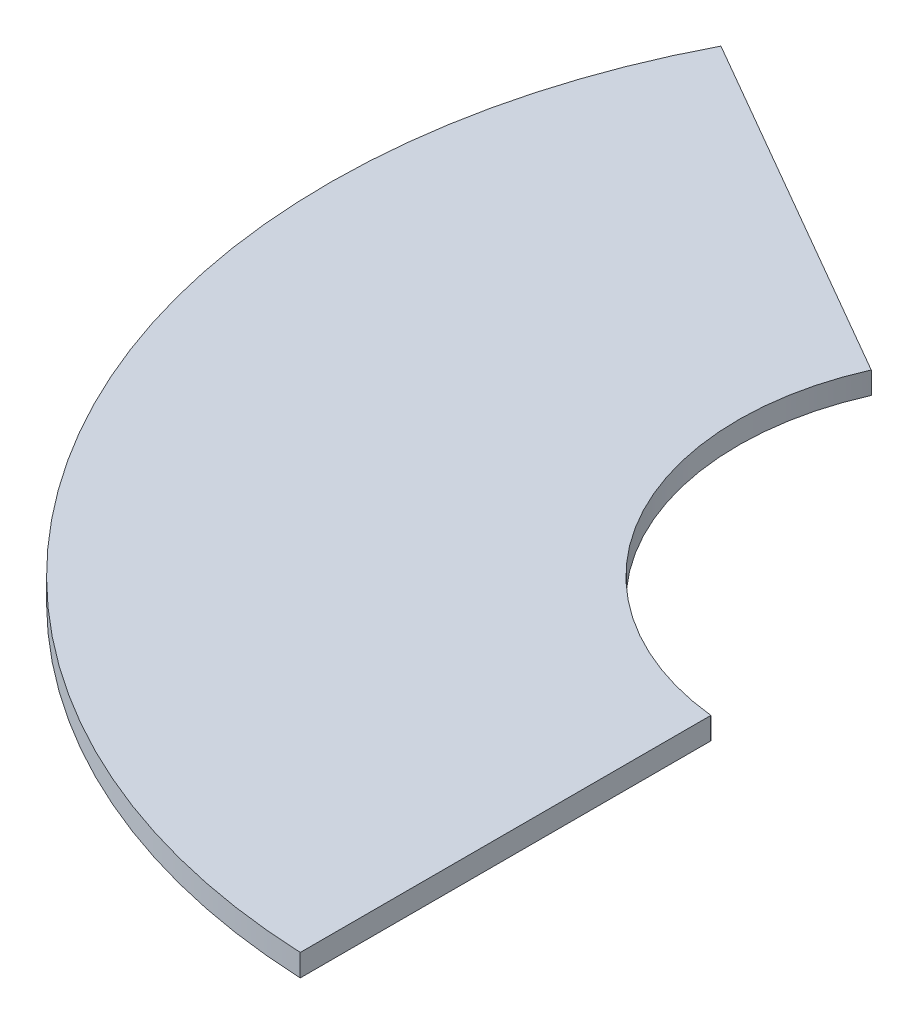
ISO-10303-21;
HEADER;
FILE_DESCRIPTION(('STEP AP214'),'2;1');
FILE_NAME('part.step','',(''),(''),'','','');
FILE_SCHEMA(('AUTOMOTIVE_DESIGN { 1 0 10303 214 1 1 1 1 }'));
ENDSEC;
DATA;
#1=APPLICATION_CONTEXT('core data for automotive mechanical design processes');
#2=APPLICATION_PROTOCOL_DEFINITION('international standard','automotive_design',2000,#1);
#3=PRODUCT_CONTEXT('',#1,'mechanical');
#4=PRODUCT('Part','Part','',(#3));
#5=PRODUCT_RELATED_PRODUCT_CATEGORY('part','',(#4));
#6=PRODUCT_DEFINITION_FORMATION('','',#4);
#7=PRODUCT_DEFINITION_CONTEXT('part definition',#1,'design');
#8=PRODUCT_DEFINITION('design','',#6,#7);
#9=PRODUCT_DEFINITION_SHAPE('','',#8);
#10=(LENGTH_UNIT() NAMED_UNIT(*) SI_UNIT(.MILLI.,.METRE.));
#11=(NAMED_UNIT(*) PLANE_ANGLE_UNIT() SI_UNIT($,.RADIAN.));
#12=(NAMED_UNIT(*) SI_UNIT($,.STERADIAN.) SOLID_ANGLE_UNIT());
#13=UNCERTAINTY_MEASURE_WITH_UNIT(LENGTH_MEASURE(1.E-05),#10,'distance_accuracy_value','');
#14=(GEOMETRIC_REPRESENTATION_CONTEXT(3) GLOBAL_UNCERTAINTY_ASSIGNED_CONTEXT((#13)) GLOBAL_UNIT_ASSIGNED_CONTEXT((#10,
#11,#12)) REPRESENTATION_CONTEXT('',''));
#15=CARTESIAN_POINT('',(0.,0.,0.));
#16=DIRECTION('',(0.,0.,1.));
#17=DIRECTION('',(1.,0.,0.));
#18=AXIS2_PLACEMENT_3D('',#15,#16,#17);
#19=CARTESIAN_POINT('',(0.,145.904708787959,0.));
#20=DIRECTION('',(0.,1.,0.));
#21=DIRECTION('',(0.,0.,1.));
#22=AXIS2_PLACEMENT_3D('',#19,#20,#21);
#23=CYLINDRICAL_SURFACE('',#22,33.7212763077138);
#24=CARTESIAN_POINT('',(0.,146.999,0.));
#25=DIRECTION('',(0.,1.,0.));
#26=DIRECTION('',(-0.886504057005299,0.,-0.46272081962361));
#27=AXIS2_PLACEMENT_3D('',#24,#25,#26);
#28=CIRCLE('',#27,33.7212763077138);
#29=CARTESIAN_POINT('',(-29.8940482541849,146.999,-15.6035366118595));
#30=VERTEX_POINT('',#29);
#31=CARTESIAN_POINT('',(-1.43396503234122,146.999,33.6907735160118));
#32=VERTEX_POINT('',#31);
#33=EDGE_CURVE('E112',#30,#32,#28,.T.);
#34=ORIENTED_EDGE('',*,*,#33,.F.);
#35=DIRECTION('',(0.,1.,0.));
#36=VECTOR('',#35,1.);
#37=CARTESIAN_POINT('',(-29.8940482541849,145.904708787959,-15.6035366118595));
#38=LINE('',#37,#36);
#39=CARTESIAN_POINT('',(-29.8940482541849,145.904708787959,-15.6035366118595));
#40=VERTEX_POINT('',#39);
#41=EDGE_CURVE('E32',#40,#30,#38,.T.);
#42=ORIENTED_EDGE('',*,*,#41,.F.);
#43=CARTESIAN_POINT('',(0.,145.904708787959,0.));
#44=DIRECTION('',(0.,1.,0.));
#45=DIRECTION('',(-0.886504057005299,0.,-0.46272081962361));
#46=AXIS2_PLACEMENT_3D('',#43,#44,#45);
#47=CIRCLE('',#46,33.7212763077138);
#48=CARTESIAN_POINT('',(-1.43396503234122,145.904708787959,33.6907735160118));
#49=VERTEX_POINT('',#48);
#50=EDGE_CURVE('E132',#40,#49,#47,.T.);
#51=ORIENTED_EDGE('',*,*,#50,.T.);
#52=DIRECTION('',(0.,1.,0.));
#53=VECTOR('',#52,1.);
#54=CARTESIAN_POINT('',(-1.43396503234122,145.904708787959,33.6907735160118));
#55=LINE('',#54,#53);
#56=EDGE_CURVE('E10',#49,#32,#55,.T.);
#57=ORIENTED_EDGE('',*,*,#56,.T.);
#58=EDGE_LOOP('',(#34,#42,#51,#57));
#59=FACE_BOUND('',#58,.T.);
#60=ADVANCED_FACE('F16',(#59),#23,.T.);
#61=CARTESIAN_POINT('',(-1.99999999999999,145.904708787959,33.0894931879131));
#62=DIRECTION('',(-0.728125004038109,0.,0.685444365717965));
#63=DIRECTION('',(0.685444365717965,0.,0.728125004038109));
#64=AXIS2_PLACEMENT_3D('',#61,#62,#63);
#65=PLANE('',#64);
#66=DIRECTION('',(0.685444365717965,0.,0.728125004038109));
#67=VECTOR('',#66,1.);
#68=CARTESIAN_POINT('',(-1.99999999999999,146.999,33.0894931879131));
#69=LINE('',#68,#67);
#70=CARTESIAN_POINT('',(-1.42860392484438,146.999,33.6964684441679));
#71=VERTEX_POINT('',#70);
#72=EDGE_CURVE('E115',#32,#71,#69,.T.);
#73=ORIENTED_EDGE('',*,*,#72,.F.);
#74=ORIENTED_EDGE('',*,*,#56,.F.);
#75=DIRECTION('',(0.685444365717965,0.,0.728125004038109));
#76=VECTOR('',#75,1.);
#77=CARTESIAN_POINT('',(-1.99999999999999,145.904708787959,33.0894931879131));
#78=LINE('',#77,#76);
#79=CARTESIAN_POINT('',(-1.42860392484438,145.904708787959,33.6964684441679));
#80=VERTEX_POINT('',#79);
#81=EDGE_CURVE('E141',#49,#80,#78,.T.);
#82=ORIENTED_EDGE('',*,*,#81,.T.);
#83=DIRECTION('',(0.,1.,0.));
#84=VECTOR('',#83,1.);
#85=CARTESIAN_POINT('',(-1.42860392484438,145.904708787959,33.6964684441679));
#86=LINE('',#85,#84);
#87=EDGE_CURVE('E24',#80,#71,#86,.T.);
#88=ORIENTED_EDGE('',*,*,#87,.T.);
#89=EDGE_LOOP('',(#73,#74,#82,#88));
#90=FACE_BOUND('',#89,.T.);
#91=ADVANCED_FACE('F140',(#90),#65,.T.);
#92=CARTESIAN_POINT('',(-1.42860392484439,145.904708787959,33.6964684441679));
#93=DIRECTION('',(1.,0.,0.));
#94=DIRECTION('',(0.,0.,-1.));
#95=AXIS2_PLACEMENT_3D('',#92,#93,#94);
#96=PLANE('',#95);
#97=DIRECTION('',(0.,0.,-1.));
#98=VECTOR('',#97,1.);
#99=CARTESIAN_POINT('',(-1.42860392484439,146.999,33.6964684441679));
#100=LINE('',#99,#98);
#101=CARTESIAN_POINT('',(-1.4286039248444,146.999,13.3615629438436));
#102=VERTEX_POINT('',#101);
#103=EDGE_CURVE('E118',#71,#102,#100,.T.);
#104=ORIENTED_EDGE('',*,*,#103,.F.);
#105=ORIENTED_EDGE('',*,*,#87,.F.);
#106=DIRECTION('',(0.,0.,-1.));
#107=VECTOR('',#106,1.);
#108=CARTESIAN_POINT('',(-1.42860392484439,145.904708787959,33.6964684441679));
#109=LINE('',#108,#107);
#110=CARTESIAN_POINT('',(-1.4286039248444,145.904708787959,13.3615629438436));
#111=VERTEX_POINT('',#110);
#112=EDGE_CURVE('E150',#80,#111,#109,.T.);
#113=ORIENTED_EDGE('',*,*,#112,.T.);
#114=DIRECTION('',(0.,1.,0.));
#115=VECTOR('',#114,1.);
#116=CARTESIAN_POINT('',(-1.4286039248444,145.904708787959,13.3615629438436));
#117=LINE('',#116,#115);
#118=EDGE_CURVE('E138',#111,#102,#117,.T.);
#119=ORIENTED_EDGE('',*,*,#118,.T.);
#120=EDGE_LOOP('',(#104,#105,#113,#119));
#121=FACE_BOUND('',#120,.T.);
#122=ADVANCED_FACE('F145',(#121),#96,.T.);
#123=CARTESIAN_POINT('',(-2.,145.904708787959,13.856406460551));
#124=DIRECTION('',(0.654653670707978,0.,0.755928946018454));
#125=DIRECTION('',(0.755928946018454,0.,-0.654653670707978));
#126=AXIS2_PLACEMENT_3D('',#123,#124,#125);
#127=PLANE('',#126);
#128=DIRECTION('',(0.755928946018454,0.,-0.654653670707978));
#129=VECTOR('',#128,1.);
#130=CARTESIAN_POINT('',(-2.,146.999,13.856406460551));
#131=LINE('',#130,#129);
#132=CARTESIAN_POINT('',(-1.41917990733078,146.999,13.3534015052711));
#133=VERTEX_POINT('',#132);
#134=EDGE_CURVE('E121',#102,#133,#131,.T.);
#135=ORIENTED_EDGE('',*,*,#134,.F.);
#136=ORIENTED_EDGE('',*,*,#118,.F.);
#137=DIRECTION('',(0.755928946018454,0.,-0.654653670707978));
#138=VECTOR('',#137,1.);
#139=CARTESIAN_POINT('',(-2.,145.904708787959,13.856406460551));
#140=LINE('',#139,#138);
#141=CARTESIAN_POINT('',(-1.41917990733078,145.904708787959,13.3534015052711));
#142=VERTEX_POINT('',#141);
#143=EDGE_CURVE('E154',#111,#142,#140,.T.);
#144=ORIENTED_EDGE('',*,*,#143,.T.);
#145=DIRECTION('',(0.,1.,0.));
#146=VECTOR('',#145,1.);
#147=CARTESIAN_POINT('',(-1.41917990733078,145.904708787959,13.3534015052711));
#148=LINE('',#147,#146);
#149=EDGE_CURVE('E136',#142,#133,#148,.T.);
#150=ORIENTED_EDGE('',*,*,#149,.T.);
#151=EDGE_LOOP('',(#135,#136,#144,#150));
#152=FACE_BOUND('',#151,.T.);
#153=ADVANCED_FACE('F161',(#152),#127,.T.);
#154=CARTESIAN_POINT('',(0.,145.904708787959,0.));
#155=DIRECTION('',(0.,1.,0.));
#156=DIRECTION('',(0.,0.,1.));
#157=AXIS2_PLACEMENT_3D('',#154,#155,#156);
#158=CYLINDRICAL_SURFACE('',#157,13.4286039248444);
#159=CARTESIAN_POINT('',(0.,146.999,0.));
#160=DIRECTION('',(0.,-1.,0.));
#161=DIRECTION('',(-0.105683354373505,0.,0.994399833371046));
#162=AXIS2_PLACEMENT_3D('',#159,#160,#161);
#163=CIRCLE('',#162,13.4286039248444);
#164=CARTESIAN_POINT('',(-12.2739748841635,146.999,-5.44765490034648));
#165=VERTEX_POINT('',#164);
#166=EDGE_CURVE('E124',#133,#165,#163,.T.);
#167=ORIENTED_EDGE('',*,*,#166,.F.);
#168=ORIENTED_EDGE('',*,*,#149,.F.);
#169=CARTESIAN_POINT('',(0.,145.904708787959,0.));
#170=DIRECTION('',(0.,-1.,0.));
#171=DIRECTION('',(-0.105683354373505,0.,0.994399833371046));
#172=AXIS2_PLACEMENT_3D('',#169,#170,#171);
#173=CIRCLE('',#172,13.4286039248444);
#174=CARTESIAN_POINT('',(-12.2739748841635,145.904708787959,-5.44765490034648));
#175=VERTEX_POINT('',#174);
#176=EDGE_CURVE('E103',#142,#175,#173,.T.);
#177=ORIENTED_EDGE('',*,*,#176,.T.);
#178=DIRECTION('',(0.,1.,0.));
#179=VECTOR('',#178,1.);
#180=CARTESIAN_POINT('',(-12.2739748841635,145.904708787959,-5.44765490034648));
#181=LINE('',#180,#179);
#182=EDGE_CURVE('E95',#175,#165,#181,.T.);
#183=ORIENTED_EDGE('',*,*,#182,.T.);
#184=EDGE_LOOP('',(#167,#168,#177,#183));
#185=FACE_BOUND('',#184,.T.);
#186=ADVANCED_FACE('F158',(#185),#158,.F.);
#187=CARTESIAN_POINT('',(-13.0000000000001,145.904708787959,-5.19615242270648));
#188=DIRECTION('',(-0.327326835353995,0.,-0.944911182523066));
#189=DIRECTION('',(-0.944911182523066,0.,0.327326835353995));
#190=AXIS2_PLACEMENT_3D('',#187,#188,#189);
#191=PLANE('',#190);
#192=DIRECTION('',(-0.944911182523066,0.,0.327326835353995));
#193=VECTOR('',#192,1.);
#194=CARTESIAN_POINT('',(-13.0000000000001,146.999,-5.19615242270648));
#195=LINE('',#194,#193);
#196=CARTESIAN_POINT('',(-12.2857549060555,146.999,-5.44357418106023));
#197=VERTEX_POINT('',#196);
#198=EDGE_CURVE('E127',#165,#197,#195,.T.);
#199=ORIENTED_EDGE('',*,*,#198,.F.);
#200=ORIENTED_EDGE('',*,*,#182,.F.);
#201=DIRECTION('',(-0.944911182523066,0.,0.327326835353995));
#202=VECTOR('',#201,1.);
#203=CARTESIAN_POINT('',(-13.0000000000001,145.904708787959,-5.19615242270648));
#204=LINE('',#203,#202);
#205=CARTESIAN_POINT('',(-12.2857549060555,145.904708787959,-5.44357418106023));
#206=VERTEX_POINT('',#205);
#207=EDGE_CURVE('E98',#175,#206,#204,.T.);
#208=ORIENTED_EDGE('',*,*,#207,.T.);
#209=DIRECTION('',(0.,1.,0.));
#210=VECTOR('',#209,1.);
#211=CARTESIAN_POINT('',(-12.2857549060555,145.904708787959,-5.44357418106023));
#212=LINE('',#211,#210);
#213=EDGE_CURVE('E84',#206,#197,#212,.T.);
#214=ORIENTED_EDGE('',*,*,#213,.T.);
#215=EDGE_LOOP('',(#199,#200,#208,#214));
#216=FACE_BOUND('',#215,.T.);
#217=ADVANCED_FACE('F99',(#216),#191,.T.);
#218=CARTESIAN_POINT('',(-12.2857549060555,145.904708787959,-5.44357418106023));
#219=DIRECTION('',(0.499999999999992,0.,-0.866025403784443));
#220=DIRECTION('',(-0.866025403784444,0.,-0.499999999999992));
#221=AXIS2_PLACEMENT_3D('',#218,#219,#220);
#222=PLANE('',#221);
#223=DIRECTION('',(-0.866025403784443,0.,-0.499999999999992));
#224=VECTOR('',#223,1.);
#225=CARTESIAN_POINT('',(-12.2857549060555,146.999,-5.44357418106023));
#226=LINE('',#225,#224);
#227=CARTESIAN_POINT('',(-29.8962996528924,146.999,-15.6110269312222));
#228=VERTEX_POINT('',#227);
#229=EDGE_CURVE('E91',#197,#228,#226,.T.);
#230=ORIENTED_EDGE('',*,*,#229,.F.);
#231=ORIENTED_EDGE('',*,*,#213,.F.);
#232=DIRECTION('',(-0.866025403784443,0.,-0.499999999999992));
#233=VECTOR('',#232,1.);
#234=CARTESIAN_POINT('',(-12.2857549060555,145.904708787959,-5.44357418106023));
#235=LINE('',#234,#233);
#236=CARTESIAN_POINT('',(-29.8962996528924,145.904708787959,-15.6110269312222));
#237=VERTEX_POINT('',#236);
#238=EDGE_CURVE('E88',#206,#237,#235,.T.);
#239=ORIENTED_EDGE('',*,*,#238,.T.);
#240=DIRECTION('',(0.,1.,0.));
#241=VECTOR('',#240,1.);
#242=CARTESIAN_POINT('',(-29.8962996528924,145.904708787959,-15.6110269312222));
#243=LINE('',#242,#241);
#244=EDGE_CURVE('E60',#237,#228,#243,.T.);
#245=ORIENTED_EDGE('',*,*,#244,.T.);
#246=EDGE_LOOP('',(#230,#231,#239,#245));
#247=FACE_BOUND('',#246,.T.);
#248=ADVANCED_FACE('F86',(#247),#222,.T.);
#249=CARTESIAN_POINT('',(-29.8962996528924,145.904708787959,-15.6110269312222));
#250=DIRECTION('',(-0.957674735611722,0.,0.287852567768673));
#251=DIRECTION('',(0.287852567768673,0.,0.957674735611722));
#252=AXIS2_PLACEMENT_3D('',#249,#250,#251);
#253=PLANE('',#252);
#254=DIRECTION('',(0.287852567768673,0.,0.957674735611722));
#255=VECTOR('',#254,1.);
#256=CARTESIAN_POINT('',(-29.8962996528924,146.999,-15.6110269312222));
#257=LINE('',#256,#255);
#258=EDGE_CURVE('E130',#228,#30,#257,.T.);
#259=ORIENTED_EDGE('',*,*,#258,.F.);
#260=ORIENTED_EDGE('',*,*,#244,.F.);
#261=DIRECTION('',(0.287852567768673,0.,0.957674735611722));
#262=VECTOR('',#261,1.);
#263=CARTESIAN_POINT('',(-29.8962996528924,145.904708787959,-15.6110269312222));
#264=LINE('',#263,#262);
#265=EDGE_CURVE('E107',#237,#40,#264,.T.);
#266=ORIENTED_EDGE('',*,*,#265,.T.);
#267=ORIENTED_EDGE('',*,*,#41,.T.);
#268=EDGE_LOOP('',(#259,#260,#266,#267));
#269=FACE_BOUND('',#268,.T.);
#270=ADVANCED_FACE('F217',(#269),#253,.T.);
#271=CARTESIAN_POINT('',(0.,145.904708787959,-33.15));
#272=DIRECTION('',(0.,1.,0.));
#273=DIRECTION('',(-1.,0.,0.));
#274=AXIS2_PLACEMENT_3D('',#271,#272,#273);
#275=PLANE('',#274);
#276=ORIENTED_EDGE('',*,*,#50,.F.);
#277=ORIENTED_EDGE('',*,*,#265,.F.);
#278=ORIENTED_EDGE('',*,*,#238,.F.);
#279=ORIENTED_EDGE('',*,*,#207,.F.);
#280=ORIENTED_EDGE('',*,*,#176,.F.);
#281=ORIENTED_EDGE('',*,*,#143,.F.);
#282=ORIENTED_EDGE('',*,*,#112,.F.);
#283=ORIENTED_EDGE('',*,*,#81,.F.);
#284=EDGE_LOOP('',(#276,#277,#278,#279,#280,#281,#282,#283));
#285=FACE_BOUND('',#284,.T.);
#286=ADVANCED_FACE('F106',(#285),#275,.F.);
#287=CARTESIAN_POINT('',(0.,146.999,-33.15));
#288=DIRECTION('',(0.,1.,0.));
#289=DIRECTION('',(-1.,0.,0.));
#290=AXIS2_PLACEMENT_3D('',#287,#288,#289);
#291=PLANE('',#290);
#292=ORIENTED_EDGE('',*,*,#33,.T.);
#293=ORIENTED_EDGE('',*,*,#72,.T.);
#294=ORIENTED_EDGE('',*,*,#103,.T.);
#295=ORIENTED_EDGE('',*,*,#134,.T.);
#296=ORIENTED_EDGE('',*,*,#166,.T.);
#297=ORIENTED_EDGE('',*,*,#198,.T.);
#298=ORIENTED_EDGE('',*,*,#229,.T.);
#299=ORIENTED_EDGE('',*,*,#258,.T.);
#300=EDGE_LOOP('',(#292,#293,#294,#295,#296,#297,#298,#299));
#301=FACE_BOUND('',#300,.T.);
#302=ADVANCED_FACE('F148',(#301),#291,.T.);
#303=CLOSED_SHELL('',(#60,#91,#122,#153,#186,#217,#248,#270,#286,#302));
#304=MANIFOLD_SOLID_BREP('B1',#303);
#305=ADVANCED_BREP_SHAPE_REPRESENTATION('',(#18,#304),#14);
#306=SHAPE_DEFINITION_REPRESENTATION(#9,#305);
ENDSEC;
END-ISO-10303-21;
